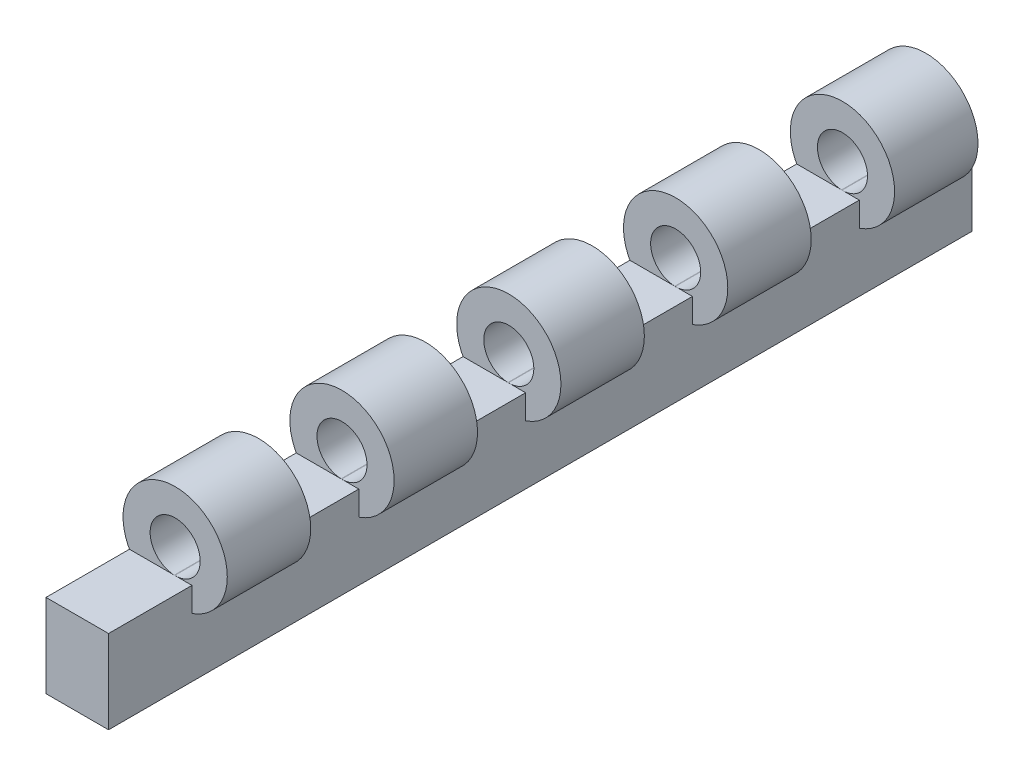
ISO-10303-21;
HEADER;
FILE_DESCRIPTION(('STEP AP214'),'2;1');
FILE_NAME('part.step','',(''),(''),'','','');
FILE_SCHEMA(('AUTOMOTIVE_DESIGN { 1 0 10303 214 1 1 1 1 }'));
ENDSEC;
DATA;
#1=APPLICATION_CONTEXT('core data for automotive mechanical design processes');
#2=APPLICATION_PROTOCOL_DEFINITION('international standard','automotive_design',2000,#1);
#3=PRODUCT_CONTEXT('',#1,'mechanical');
#4=PRODUCT('Part','Part','',(#3));
#5=PRODUCT_RELATED_PRODUCT_CATEGORY('part','',(#4));
#6=PRODUCT_DEFINITION_FORMATION('','',#4);
#7=PRODUCT_DEFINITION_CONTEXT('part definition',#1,'design');
#8=PRODUCT_DEFINITION('design','',#6,#7);
#9=PRODUCT_DEFINITION_SHAPE('','',#8);
#10=(LENGTH_UNIT() NAMED_UNIT(*) SI_UNIT(.MILLI.,.METRE.));
#11=(NAMED_UNIT(*) PLANE_ANGLE_UNIT() SI_UNIT($,.RADIAN.));
#12=(NAMED_UNIT(*) SI_UNIT($,.STERADIAN.) SOLID_ANGLE_UNIT());
#13=UNCERTAINTY_MEASURE_WITH_UNIT(LENGTH_MEASURE(1.E-05),#10,'distance_accuracy_value','');
#14=(GEOMETRIC_REPRESENTATION_CONTEXT(3) GLOBAL_UNCERTAINTY_ASSIGNED_CONTEXT((#13)) GLOBAL_UNIT_ASSIGNED_CONTEXT((#10,
#11,#12)) REPRESENTATION_CONTEXT('',''));
#15=CARTESIAN_POINT('',(0.,0.,0.));
#16=DIRECTION('',(0.,0.,1.));
#17=DIRECTION('',(1.,0.,0.));
#18=AXIS2_PLACEMENT_3D('',#15,#16,#17);
#19=CARTESIAN_POINT('',(10.9690054932678,25.9942404430136,-96.5));
#20=DIRECTION('',(0.,0.,1.));
#21=DIRECTION('',(1.,0.,0.));
#22=AXIS2_PLACEMENT_3D('',#19,#20,#21);
#23=CYLINDRICAL_SURFACE('',#22,12.5);
#24=CARTESIAN_POINT('',(10.9690054932678,25.9942404430136,-96.5));
#25=DIRECTION('',(0.,0.,1.));
#26=DIRECTION('',(1.,0.,0.));
#27=AXIS2_PLACEMENT_3D('',#24,#25,#26);
#28=CIRCLE('',#27,12.5);
#29=CARTESIAN_POINT('',(23.4690054932679,25.9942404430136,-96.5));
#30=VERTEX_POINT('',#29);
#31=EDGE_CURVE('E11',#30,#30,#28,.T.);
#32=ORIENTED_EDGE('',*,*,#31,.T.);
#33=EDGE_LOOP('',(#32));
#34=FACE_BOUND('',#33,.T.);
#35=CARTESIAN_POINT('',(10.9690054932678,25.9942404430136,-76.5));
#36=DIRECTION('',(0.,0.,1.));
#37=DIRECTION('',(1.,0.,0.));
#38=AXIS2_PLACEMENT_3D('',#35,#36,#37);
#39=CIRCLE('',#38,12.5);
#40=CARTESIAN_POINT('',(23.4690054932679,25.9942404430136,-76.5));
#41=VERTEX_POINT('',#40);
#42=EDGE_CURVE('E44',#41,#41,#39,.T.);
#43=ORIENTED_EDGE('',*,*,#42,.F.);
#44=EDGE_LOOP('',(#43));
#45=FACE_BOUND('',#44,.T.);
#46=ADVANCED_FACE('F41',(#34,#45),#23,.T.);
#47=CARTESIAN_POINT('',(10.9690054932678,25.9942404430136,-96.5));
#48=DIRECTION('',(0.,0.,1.));
#49=DIRECTION('',(1.,0.,0.));
#50=AXIS2_PLACEMENT_3D('',#47,#48,#49);
#51=PLANE('',#50);
#52=CARTESIAN_POINT('',(10.9690054932678,25.9942404430136,-96.5));
#53=DIRECTION('',(0.,0.,1.));
#54=DIRECTION('',(1.,0.,0.));
#55=AXIS2_PLACEMENT_3D('',#52,#53,#54);
#56=CIRCLE('',#55,6.);
#57=CARTESIAN_POINT('',(16.9690054932678,25.9942404430136,-96.5));
#58=VERTEX_POINT('',#57);
#59=EDGE_CURVE('E51',#58,#58,#56,.T.);
#60=ORIENTED_EDGE('',*,*,#59,.T.);
#61=EDGE_LOOP('',(#60));
#62=FACE_BOUND('',#61,.T.);
#63=ORIENTED_EDGE('',*,*,#31,.F.);
#64=EDGE_LOOP('',(#63));
#65=FACE_BOUND('',#64,.T.);
#66=ADVANCED_FACE('F59',(#62,#65),#51,.F.);
#67=CARTESIAN_POINT('',(10.9690054932678,25.9942404430136,-76.5));
#68=DIRECTION('',(0.,0.,1.));
#69=DIRECTION('',(1.,0.,0.));
#70=AXIS2_PLACEMENT_3D('',#67,#68,#69);
#71=PLANE('',#70);
#72=CARTESIAN_POINT('',(10.9690054932678,25.9942404430136,-76.5));
#73=DIRECTION('',(0.,0.,1.));
#74=DIRECTION('',(1.,0.,0.));
#75=AXIS2_PLACEMENT_3D('',#72,#73,#74);
#76=CIRCLE('',#75,6.);
#77=CARTESIAN_POINT('',(16.9690054932678,25.9942404430136,-76.5));
#78=VERTEX_POINT('',#77);
#79=EDGE_CURVE('E53',#78,#78,#76,.T.);
#80=ORIENTED_EDGE('',*,*,#79,.F.);
#81=EDGE_LOOP('',(#80));
#82=FACE_BOUND('',#81,.T.);
#83=ORIENTED_EDGE('',*,*,#42,.T.);
#84=EDGE_LOOP('',(#83));
#85=FACE_BOUND('',#84,.T.);
#86=ADVANCED_FACE('F65',(#82,#85),#71,.T.);
#87=CARTESIAN_POINT('',(10.9690054932678,25.9942404430136,-96.5));
#88=DIRECTION('',(0.,0.,1.));
#89=DIRECTION('',(1.,0.,0.));
#90=AXIS2_PLACEMENT_3D('',#87,#88,#89);
#91=CYLINDRICAL_SURFACE('',#90,6.);
#92=ORIENTED_EDGE('',*,*,#59,.F.);
#93=EDGE_LOOP('',(#92));
#94=FACE_BOUND('',#93,.T.);
#95=ORIENTED_EDGE('',*,*,#79,.T.);
#96=EDGE_LOOP('',(#95));
#97=FACE_BOUND('',#96,.T.);
#98=ADVANCED_FACE('F62',(#94,#97),#91,.F.);
#99=CLOSED_SHELL('',(#46,#66,#86,#98));
#100=MANIFOLD_SOLID_BREP('B2',#99);
#101=CARTESIAN_POINT('',(10.9690054932678,25.9942404430136,-56.5));
#102=DIRECTION('',(0.,0.,1.));
#103=DIRECTION('',(1.,0.,0.));
#104=AXIS2_PLACEMENT_3D('',#101,#102,#103);
#105=CYLINDRICAL_SURFACE('',#104,12.5);
#106=CARTESIAN_POINT('',(10.9690054932678,25.9942404430136,-56.5));
#107=DIRECTION('',(0.,0.,1.));
#108=DIRECTION('',(1.,0.,0.));
#109=AXIS2_PLACEMENT_3D('',#106,#107,#108);
#110=CIRCLE('',#109,12.5);
#111=CARTESIAN_POINT('',(23.4690054932679,25.9942404430136,-56.5));
#112=VERTEX_POINT('',#111);
#113=EDGE_CURVE('E40',#112,#112,#110,.T.);
#114=ORIENTED_EDGE('',*,*,#113,.T.);
#115=EDGE_LOOP('',(#114));
#116=FACE_BOUND('',#115,.T.);
#117=CARTESIAN_POINT('',(10.9690054932678,25.9942404430136,-36.5));
#118=DIRECTION('',(0.,0.,1.));
#119=DIRECTION('',(1.,0.,0.));
#120=AXIS2_PLACEMENT_3D('',#117,#118,#119);
#121=CIRCLE('',#120,12.5);
#122=CARTESIAN_POINT('',(23.4690054932679,25.9942404430136,-36.5));
#123=VERTEX_POINT('',#122);
#124=EDGE_CURVE('E113',#123,#123,#121,.T.);
#125=ORIENTED_EDGE('',*,*,#124,.F.);
#126=EDGE_LOOP('',(#125));
#127=FACE_BOUND('',#126,.T.);
#128=ADVANCED_FACE('F110',(#116,#127),#105,.T.);
#129=CARTESIAN_POINT('',(10.9690054932678,25.9942404430136,-56.5));
#130=DIRECTION('',(0.,0.,1.));
#131=DIRECTION('',(1.,0.,0.));
#132=AXIS2_PLACEMENT_3D('',#129,#130,#131);
#133=PLANE('',#132);
#134=CARTESIAN_POINT('',(10.9690054932678,25.9942404430136,-56.5));
#135=DIRECTION('',(0.,0.,1.));
#136=DIRECTION('',(1.,0.,0.));
#137=AXIS2_PLACEMENT_3D('',#134,#135,#136);
#138=CIRCLE('',#137,6.);
#139=CARTESIAN_POINT('',(16.9690054932678,25.9942404430136,-56.5));
#140=VERTEX_POINT('',#139);
#141=EDGE_CURVE('E120',#140,#140,#138,.T.);
#142=ORIENTED_EDGE('',*,*,#141,.T.);
#143=EDGE_LOOP('',(#142));
#144=FACE_BOUND('',#143,.T.);
#145=ORIENTED_EDGE('',*,*,#113,.F.);
#146=EDGE_LOOP('',(#145));
#147=FACE_BOUND('',#146,.T.);
#148=ADVANCED_FACE('F128',(#144,#147),#133,.F.);
#149=CARTESIAN_POINT('',(10.9690054932678,25.9942404430136,-36.5));
#150=DIRECTION('',(0.,0.,1.));
#151=DIRECTION('',(1.,0.,0.));
#152=AXIS2_PLACEMENT_3D('',#149,#150,#151);
#153=PLANE('',#152);
#154=CARTESIAN_POINT('',(10.9690054932678,25.9942404430136,-36.5));
#155=DIRECTION('',(0.,0.,1.));
#156=DIRECTION('',(1.,0.,0.));
#157=AXIS2_PLACEMENT_3D('',#154,#155,#156);
#158=CIRCLE('',#157,6.);
#159=CARTESIAN_POINT('',(16.9690054932678,25.9942404430136,-36.5));
#160=VERTEX_POINT('',#159);
#161=EDGE_CURVE('E122',#160,#160,#158,.T.);
#162=ORIENTED_EDGE('',*,*,#161,.F.);
#163=EDGE_LOOP('',(#162));
#164=FACE_BOUND('',#163,.T.);
#165=ORIENTED_EDGE('',*,*,#124,.T.);
#166=EDGE_LOOP('',(#165));
#167=FACE_BOUND('',#166,.T.);
#168=ADVANCED_FACE('F134',(#164,#167),#153,.T.);
#169=CARTESIAN_POINT('',(10.9690054932678,25.9942404430136,-56.5));
#170=DIRECTION('',(0.,0.,1.));
#171=DIRECTION('',(1.,0.,0.));
#172=AXIS2_PLACEMENT_3D('',#169,#170,#171);
#173=CYLINDRICAL_SURFACE('',#172,6.);
#174=ORIENTED_EDGE('',*,*,#141,.F.);
#175=EDGE_LOOP('',(#174));
#176=FACE_BOUND('',#175,.T.);
#177=ORIENTED_EDGE('',*,*,#161,.T.);
#178=EDGE_LOOP('',(#177));
#179=FACE_BOUND('',#178,.T.);
#180=ADVANCED_FACE('F131',(#176,#179),#173,.F.);
#181=CLOSED_SHELL('',(#128,#148,#168,#180));
#182=MANIFOLD_SOLID_BREP('B6',#181);
#183=CARTESIAN_POINT('',(10.9690054932678,25.9942404430136,-16.5));
#184=DIRECTION('',(0.,0.,1.));
#185=DIRECTION('',(1.,0.,0.));
#186=AXIS2_PLACEMENT_3D('',#183,#184,#185);
#187=CYLINDRICAL_SURFACE('',#186,12.5);
#188=CARTESIAN_POINT('',(10.9690054932678,25.9942404430136,-16.5));
#189=DIRECTION('',(0.,0.,1.));
#190=DIRECTION('',(1.,0.,0.));
#191=AXIS2_PLACEMENT_3D('',#188,#189,#190);
#192=CIRCLE('',#191,12.5);
#193=CARTESIAN_POINT('',(23.4690054932679,25.9942404430136,-16.5));
#194=VERTEX_POINT('',#193);
#195=EDGE_CURVE('E109',#194,#194,#192,.T.);
#196=ORIENTED_EDGE('',*,*,#195,.T.);
#197=EDGE_LOOP('',(#196));
#198=FACE_BOUND('',#197,.T.);
#199=CARTESIAN_POINT('',(10.9690054932678,25.9942404430136,3.49999999999999));
#200=DIRECTION('',(0.,0.,1.));
#201=DIRECTION('',(1.,0.,0.));
#202=AXIS2_PLACEMENT_3D('',#199,#200,#201);
#203=CIRCLE('',#202,12.5);
#204=CARTESIAN_POINT('',(23.4690054932679,25.9942404430136,3.49999999999999));
#205=VERTEX_POINT('',#204);
#206=EDGE_CURVE('E182',#205,#205,#203,.T.);
#207=ORIENTED_EDGE('',*,*,#206,.F.);
#208=EDGE_LOOP('',(#207));
#209=FACE_BOUND('',#208,.T.);
#210=ADVANCED_FACE('F179',(#198,#209),#187,.T.);
#211=CARTESIAN_POINT('',(10.9690054932678,25.9942404430136,-16.5));
#212=DIRECTION('',(0.,0.,1.));
#213=DIRECTION('',(1.,0.,0.));
#214=AXIS2_PLACEMENT_3D('',#211,#212,#213);
#215=PLANE('',#214);
#216=CARTESIAN_POINT('',(10.9690054932678,25.9942404430136,-16.5));
#217=DIRECTION('',(0.,0.,1.));
#218=DIRECTION('',(1.,0.,0.));
#219=AXIS2_PLACEMENT_3D('',#216,#217,#218);
#220=CIRCLE('',#219,6.);
#221=CARTESIAN_POINT('',(16.9690054932678,25.9942404430136,-16.5));
#222=VERTEX_POINT('',#221);
#223=EDGE_CURVE('E189',#222,#222,#220,.T.);
#224=ORIENTED_EDGE('',*,*,#223,.T.);
#225=EDGE_LOOP('',(#224));
#226=FACE_BOUND('',#225,.T.);
#227=ORIENTED_EDGE('',*,*,#195,.F.);
#228=EDGE_LOOP('',(#227));
#229=FACE_BOUND('',#228,.T.);
#230=ADVANCED_FACE('F197',(#226,#229),#215,.F.);
#231=CARTESIAN_POINT('',(10.9690054932678,25.9942404430136,3.49999999999999));
#232=DIRECTION('',(0.,0.,1.));
#233=DIRECTION('',(1.,0.,0.));
#234=AXIS2_PLACEMENT_3D('',#231,#232,#233);
#235=PLANE('',#234);
#236=CARTESIAN_POINT('',(10.9690054932678,25.9942404430136,3.49999999999999));
#237=DIRECTION('',(0.,0.,1.));
#238=DIRECTION('',(1.,0.,0.));
#239=AXIS2_PLACEMENT_3D('',#236,#237,#238);
#240=CIRCLE('',#239,6.);
#241=CARTESIAN_POINT('',(16.9690054932678,25.9942404430136,3.49999999999999));
#242=VERTEX_POINT('',#241);
#243=EDGE_CURVE('E191',#242,#242,#240,.T.);
#244=ORIENTED_EDGE('',*,*,#243,.F.);
#245=EDGE_LOOP('',(#244));
#246=FACE_BOUND('',#245,.T.);
#247=ORIENTED_EDGE('',*,*,#206,.T.);
#248=EDGE_LOOP('',(#247));
#249=FACE_BOUND('',#248,.T.);
#250=ADVANCED_FACE('F203',(#246,#249),#235,.T.);
#251=CARTESIAN_POINT('',(10.9690054932678,25.9942404430136,-16.5));
#252=DIRECTION('',(0.,0.,1.));
#253=DIRECTION('',(1.,0.,0.));
#254=AXIS2_PLACEMENT_3D('',#251,#252,#253);
#255=CYLINDRICAL_SURFACE('',#254,6.);
#256=ORIENTED_EDGE('',*,*,#223,.F.);
#257=EDGE_LOOP('',(#256));
#258=FACE_BOUND('',#257,.T.);
#259=ORIENTED_EDGE('',*,*,#243,.T.);
#260=EDGE_LOOP('',(#259));
#261=FACE_BOUND('',#260,.T.);
#262=ADVANCED_FACE('F200',(#258,#261),#255,.F.);
#263=CLOSED_SHELL('',(#210,#230,#250,#262));
#264=MANIFOLD_SOLID_BREP('B35',#263);
#265=CARTESIAN_POINT('',(10.9690054932678,25.9942404430136,23.5));
#266=DIRECTION('',(0.,0.,1.));
#267=DIRECTION('',(1.,0.,0.));
#268=AXIS2_PLACEMENT_3D('',#265,#266,#267);
#269=CYLINDRICAL_SURFACE('',#268,12.5);
#270=CARTESIAN_POINT('',(10.9690054932678,25.9942404430136,23.5));
#271=DIRECTION('',(0.,0.,1.));
#272=DIRECTION('',(1.,0.,0.));
#273=AXIS2_PLACEMENT_3D('',#270,#271,#272);
#274=CIRCLE('',#273,12.5);
#275=CARTESIAN_POINT('',(23.4690054932679,25.9942404430136,23.5));
#276=VERTEX_POINT('',#275);
#277=EDGE_CURVE('E178',#276,#276,#274,.T.);
#278=ORIENTED_EDGE('',*,*,#277,.T.);
#279=EDGE_LOOP('',(#278));
#280=FACE_BOUND('',#279,.T.);
#281=CARTESIAN_POINT('',(10.9690054932678,25.9942404430136,43.5));
#282=DIRECTION('',(0.,0.,1.));
#283=DIRECTION('',(1.,0.,0.));
#284=AXIS2_PLACEMENT_3D('',#281,#282,#283);
#285=CIRCLE('',#284,12.5);
#286=CARTESIAN_POINT('',(23.4690054932679,25.9942404430136,43.5));
#287=VERTEX_POINT('',#286);
#288=EDGE_CURVE('E251',#287,#287,#285,.T.);
#289=ORIENTED_EDGE('',*,*,#288,.F.);
#290=EDGE_LOOP('',(#289));
#291=FACE_BOUND('',#290,.T.);
#292=ADVANCED_FACE('F248',(#280,#291),#269,.T.);
#293=CARTESIAN_POINT('',(10.9690054932678,25.9942404430136,23.5));
#294=DIRECTION('',(0.,0.,1.));
#295=DIRECTION('',(1.,0.,0.));
#296=AXIS2_PLACEMENT_3D('',#293,#294,#295);
#297=PLANE('',#296);
#298=CARTESIAN_POINT('',(10.9690054932678,25.9942404430136,23.5));
#299=DIRECTION('',(0.,0.,1.));
#300=DIRECTION('',(1.,0.,0.));
#301=AXIS2_PLACEMENT_3D('',#298,#299,#300);
#302=CIRCLE('',#301,6.);
#303=CARTESIAN_POINT('',(16.9690054932678,25.9942404430136,23.5));
#304=VERTEX_POINT('',#303);
#305=EDGE_CURVE('E258',#304,#304,#302,.T.);
#306=ORIENTED_EDGE('',*,*,#305,.T.);
#307=EDGE_LOOP('',(#306));
#308=FACE_BOUND('',#307,.T.);
#309=ORIENTED_EDGE('',*,*,#277,.F.);
#310=EDGE_LOOP('',(#309));
#311=FACE_BOUND('',#310,.T.);
#312=ADVANCED_FACE('F266',(#308,#311),#297,.F.);
#313=CARTESIAN_POINT('',(10.9690054932678,25.9942404430136,43.5));
#314=DIRECTION('',(0.,0.,1.));
#315=DIRECTION('',(1.,0.,0.));
#316=AXIS2_PLACEMENT_3D('',#313,#314,#315);
#317=PLANE('',#316);
#318=CARTESIAN_POINT('',(10.9690054932678,25.9942404430136,43.5));
#319=DIRECTION('',(0.,0.,1.));
#320=DIRECTION('',(1.,0.,0.));
#321=AXIS2_PLACEMENT_3D('',#318,#319,#320);
#322=CIRCLE('',#321,6.);
#323=CARTESIAN_POINT('',(16.9690054932678,25.9942404430136,43.5));
#324=VERTEX_POINT('',#323);
#325=EDGE_CURVE('E260',#324,#324,#322,.T.);
#326=ORIENTED_EDGE('',*,*,#325,.F.);
#327=EDGE_LOOP('',(#326));
#328=FACE_BOUND('',#327,.T.);
#329=ORIENTED_EDGE('',*,*,#288,.T.);
#330=EDGE_LOOP('',(#329));
#331=FACE_BOUND('',#330,.T.);
#332=ADVANCED_FACE('F272',(#328,#331),#317,.T.);
#333=CARTESIAN_POINT('',(10.9690054932678,25.9942404430136,23.5));
#334=DIRECTION('',(0.,0.,1.));
#335=DIRECTION('',(1.,0.,0.));
#336=AXIS2_PLACEMENT_3D('',#333,#334,#335);
#337=CYLINDRICAL_SURFACE('',#336,6.);
#338=ORIENTED_EDGE('',*,*,#305,.F.);
#339=EDGE_LOOP('',(#338));
#340=FACE_BOUND('',#339,.T.);
#341=ORIENTED_EDGE('',*,*,#325,.T.);
#342=EDGE_LOOP('',(#341));
#343=FACE_BOUND('',#342,.T.);
#344=ADVANCED_FACE('F269',(#340,#343),#337,.F.);
#345=CLOSED_SHELL('',(#292,#312,#332,#344));
#346=MANIFOLD_SOLID_BREP('B104',#345);
#347=CARTESIAN_POINT('',(10.9690054932678,25.9942404430136,63.5));
#348=DIRECTION('',(0.,0.,1.));
#349=DIRECTION('',(1.,0.,0.));
#350=AXIS2_PLACEMENT_3D('',#347,#348,#349);
#351=CYLINDRICAL_SURFACE('',#350,12.5);
#352=CARTESIAN_POINT('',(10.9690054932678,25.9942404430136,63.5));
#353=DIRECTION('',(0.,0.,1.));
#354=DIRECTION('',(1.,0.,0.));
#355=AXIS2_PLACEMENT_3D('',#352,#353,#354);
#356=CIRCLE('',#355,12.5);
#357=CARTESIAN_POINT('',(23.4690054932679,25.9942404430136,63.5));
#358=VERTEX_POINT('',#357);
#359=EDGE_CURVE('E247',#358,#358,#356,.T.);
#360=ORIENTED_EDGE('',*,*,#359,.T.);
#361=EDGE_LOOP('',(#360));
#362=FACE_BOUND('',#361,.T.);
#363=CARTESIAN_POINT('',(10.9690054932678,25.9942404430136,83.5));
#364=DIRECTION('',(0.,0.,1.));
#365=DIRECTION('',(1.,0.,0.));
#366=AXIS2_PLACEMENT_3D('',#363,#364,#365);
#367=CIRCLE('',#366,12.5);
#368=CARTESIAN_POINT('',(23.4690054932679,25.9942404430136,83.5));
#369=VERTEX_POINT('',#368);
#370=EDGE_CURVE('E321',#369,#369,#367,.T.);
#371=ORIENTED_EDGE('',*,*,#370,.F.);
#372=EDGE_LOOP('',(#371));
#373=FACE_BOUND('',#372,.T.);
#374=ADVANCED_FACE('F318',(#362,#373),#351,.T.);
#375=CARTESIAN_POINT('',(10.9690054932678,25.9942404430136,63.5));
#376=DIRECTION('',(0.,0.,1.));
#377=DIRECTION('',(1.,0.,0.));
#378=AXIS2_PLACEMENT_3D('',#375,#376,#377);
#379=PLANE('',#378);
#380=CARTESIAN_POINT('',(10.9690054932678,25.9942404430136,63.5));
#381=DIRECTION('',(0.,0.,1.));
#382=DIRECTION('',(1.,0.,0.));
#383=AXIS2_PLACEMENT_3D('',#380,#381,#382);
#384=CIRCLE('',#383,6.);
#385=CARTESIAN_POINT('',(16.9690054932678,25.9942404430136,63.5));
#386=VERTEX_POINT('',#385);
#387=EDGE_CURVE('E328',#386,#386,#384,.T.);
#388=ORIENTED_EDGE('',*,*,#387,.T.);
#389=EDGE_LOOP('',(#388));
#390=FACE_BOUND('',#389,.T.);
#391=ORIENTED_EDGE('',*,*,#359,.F.);
#392=EDGE_LOOP('',(#391));
#393=FACE_BOUND('',#392,.T.);
#394=ADVANCED_FACE('F336',(#390,#393),#379,.F.);
#395=CARTESIAN_POINT('',(10.9690054932678,25.9942404430136,83.5));
#396=DIRECTION('',(0.,0.,1.));
#397=DIRECTION('',(1.,0.,0.));
#398=AXIS2_PLACEMENT_3D('',#395,#396,#397);
#399=PLANE('',#398);
#400=CARTESIAN_POINT('',(10.9690054932678,25.9942404430136,83.5));
#401=DIRECTION('',(0.,0.,1.));
#402=DIRECTION('',(1.,0.,0.));
#403=AXIS2_PLACEMENT_3D('',#400,#401,#402);
#404=CIRCLE('',#403,6.);
#405=CARTESIAN_POINT('',(16.9690054932678,25.9942404430136,83.5));
#406=VERTEX_POINT('',#405);
#407=EDGE_CURVE('E330',#406,#406,#404,.T.);
#408=ORIENTED_EDGE('',*,*,#407,.F.);
#409=EDGE_LOOP('',(#408));
#410=FACE_BOUND('',#409,.T.);
#411=ORIENTED_EDGE('',*,*,#370,.T.);
#412=EDGE_LOOP('',(#411));
#413=FACE_BOUND('',#412,.T.);
#414=ADVANCED_FACE('F342',(#410,#413),#399,.T.);
#415=CARTESIAN_POINT('',(10.9690054932678,25.9942404430136,63.5));
#416=DIRECTION('',(0.,0.,1.));
#417=DIRECTION('',(1.,0.,0.));
#418=AXIS2_PLACEMENT_3D('',#415,#416,#417);
#419=CYLINDRICAL_SURFACE('',#418,6.);
#420=ORIENTED_EDGE('',*,*,#387,.F.);
#421=EDGE_LOOP('',(#420));
#422=FACE_BOUND('',#421,.T.);
#423=ORIENTED_EDGE('',*,*,#407,.T.);
#424=EDGE_LOOP('',(#423));
#425=FACE_BOUND('',#424,.T.);
#426=ADVANCED_FACE('F339',(#422,#425),#419,.F.);
#427=CLOSED_SHELL('',(#374,#394,#414,#426));
#428=MANIFOLD_SOLID_BREP('B173',#427);
#429=CARTESIAN_POINT('',(15.,20.,103.5));
#430=DIRECTION('',(0.,0.,-1.));
#431=DIRECTION('',(-1.,0.,0.));
#432=AXIS2_PLACEMENT_3D('',#429,#430,#431);
#433=PLANE('',#432);
#434=DIRECTION('',(1.,0.,0.));
#435=VECTOR('',#434,1.);
#436=CARTESIAN_POINT('',(15.,0.,103.5));
#437=LINE('',#436,#435);
#438=CARTESIAN_POINT('',(0.,0.,103.5));
#439=VERTEX_POINT('',#438);
#440=CARTESIAN_POINT('',(15.,0.,103.5));
#441=VERTEX_POINT('',#440);
#442=EDGE_CURVE('E442',#439,#441,#437,.T.);
#443=ORIENTED_EDGE('',*,*,#442,.T.);
#444=DIRECTION('',(0.,-1.,0.));
#445=VECTOR('',#444,1.);
#446=CARTESIAN_POINT('',(15.,20.,103.5));
#447=LINE('',#446,#445);
#448=CARTESIAN_POINT('',(15.,20.,103.5));
#449=VERTEX_POINT('',#448);
#450=EDGE_CURVE('E316',#449,#441,#447,.T.);
#451=ORIENTED_EDGE('',*,*,#450,.F.);
#452=DIRECTION('',(1.,0.,0.));
#453=VECTOR('',#452,1.);
#454=CARTESIAN_POINT('',(15.,20.,103.5));
#455=LINE('',#454,#453);
#456=CARTESIAN_POINT('',(0.,20.,103.5));
#457=VERTEX_POINT('',#456);
#458=EDGE_CURVE('E430',#457,#449,#455,.T.);
#459=ORIENTED_EDGE('',*,*,#458,.F.);
#460=DIRECTION('',(0.,-1.,0.));
#461=VECTOR('',#460,1.);
#462=CARTESIAN_POINT('',(0.,20.,103.5));
#463=LINE('',#462,#461);
#464=EDGE_CURVE('E438',#457,#439,#463,.T.);
#465=ORIENTED_EDGE('',*,*,#464,.T.);
#466=EDGE_LOOP('',(#443,#451,#459,#465));
#467=FACE_BOUND('',#466,.T.);
#468=ADVANCED_FACE('F379',(#467),#433,.F.);
#469=CARTESIAN_POINT('',(15.,20.,-103.5));
#470=DIRECTION('',(-1.,0.,0.));
#471=DIRECTION('',(0.,0.,1.));
#472=AXIS2_PLACEMENT_3D('',#469,#470,#471);
#473=PLANE('',#472);
#474=DIRECTION('',(0.,0.,-1.));
#475=VECTOR('',#474,1.);
#476=CARTESIAN_POINT('',(15.,0.,-103.5));
#477=LINE('',#476,#475);
#478=CARTESIAN_POINT('',(15.,0.,-103.5));
#479=VERTEX_POINT('',#478);
#480=EDGE_CURVE('E434',#441,#479,#477,.T.);
#481=ORIENTED_EDGE('',*,*,#480,.T.);
#482=DIRECTION('',(0.,-1.,0.));
#483=VECTOR('',#482,1.);
#484=CARTESIAN_POINT('',(15.,20.,-103.5));
#485=LINE('',#484,#483);
#486=CARTESIAN_POINT('',(15.,20.,-103.5));
#487=VERTEX_POINT('',#486);
#488=EDGE_CURVE('E387',#487,#479,#485,.T.);
#489=ORIENTED_EDGE('',*,*,#488,.F.);
#490=DIRECTION('',(0.,0.,-1.));
#491=VECTOR('',#490,1.);
#492=CARTESIAN_POINT('',(15.,20.,-103.5));
#493=LINE('',#492,#491);
#494=EDGE_CURVE('E425',#449,#487,#493,.T.);
#495=ORIENTED_EDGE('',*,*,#494,.F.);
#496=ORIENTED_EDGE('',*,*,#450,.T.);
#497=EDGE_LOOP('',(#481,#489,#495,#496));
#498=FACE_BOUND('',#497,.T.);
#499=ADVANCED_FACE('F433',(#498),#473,.F.);
#500=CARTESIAN_POINT('',(0.,20.,-103.5));
#501=DIRECTION('',(0.,0.,1.));
#502=DIRECTION('',(1.,0.,0.));
#503=AXIS2_PLACEMENT_3D('',#500,#501,#502);
#504=PLANE('',#503);
#505=DIRECTION('',(-1.,0.,0.));
#506=VECTOR('',#505,1.);
#507=CARTESIAN_POINT('',(0.,0.,-103.5));
#508=LINE('',#507,#506);
#509=CARTESIAN_POINT('',(0.,0.,-103.5));
#510=VERTEX_POINT('',#509);
#511=EDGE_CURVE('E412',#479,#510,#508,.T.);
#512=ORIENTED_EDGE('',*,*,#511,.T.);
#513=DIRECTION('',(0.,-1.,0.));
#514=VECTOR('',#513,1.);
#515=CARTESIAN_POINT('',(0.,20.,-103.5));
#516=LINE('',#515,#514);
#517=CARTESIAN_POINT('',(0.,20.,-103.5));
#518=VERTEX_POINT('',#517);
#519=EDGE_CURVE('E435',#518,#510,#516,.T.);
#520=ORIENTED_EDGE('',*,*,#519,.F.);
#521=DIRECTION('',(-1.,0.,0.));
#522=VECTOR('',#521,1.);
#523=CARTESIAN_POINT('',(0.,20.,-103.5));
#524=LINE('',#523,#522);
#525=EDGE_CURVE('E428',#487,#518,#524,.T.);
#526=ORIENTED_EDGE('',*,*,#525,.F.);
#527=ORIENTED_EDGE('',*,*,#488,.T.);
#528=EDGE_LOOP('',(#512,#520,#526,#527));
#529=FACE_BOUND('',#528,.T.);
#530=ADVANCED_FACE('F436',(#529),#504,.F.);
#531=CARTESIAN_POINT('',(0.,20.,-103.5));
#532=DIRECTION('',(1.,0.,0.));
#533=DIRECTION('',(0.,0.,-1.));
#534=AXIS2_PLACEMENT_3D('',#531,#532,#533);
#535=PLANE('',#534);
#536=DIRECTION('',(0.,0.,1.));
#537=VECTOR('',#536,1.);
#538=CARTESIAN_POINT('',(0.,0.,-103.5));
#539=LINE('',#538,#537);
#540=EDGE_CURVE('E418',#510,#439,#539,.T.);
#541=ORIENTED_EDGE('',*,*,#540,.T.);
#542=ORIENTED_EDGE('',*,*,#464,.F.);
#543=DIRECTION('',(0.,0.,1.));
#544=VECTOR('',#543,1.);
#545=CARTESIAN_POINT('',(0.,20.,-103.5));
#546=LINE('',#545,#544);
#547=EDGE_CURVE('E395',#518,#457,#546,.T.);
#548=ORIENTED_EDGE('',*,*,#547,.F.);
#549=ORIENTED_EDGE('',*,*,#519,.T.);
#550=EDGE_LOOP('',(#541,#542,#548,#549));
#551=FACE_BOUND('',#550,.T.);
#552=ADVANCED_FACE('F449',(#551),#535,.F.);
#553=CARTESIAN_POINT('',(0.,20.,0.));
#554=DIRECTION('',(0.,1.,0.));
#555=DIRECTION('',(0.,0.,1.));
#556=AXIS2_PLACEMENT_3D('',#553,#554,#555);
#557=PLANE('',#556);
#558=ORIENTED_EDGE('',*,*,#458,.T.);
#559=ORIENTED_EDGE('',*,*,#494,.T.);
#560=ORIENTED_EDGE('',*,*,#525,.T.);
#561=ORIENTED_EDGE('',*,*,#547,.T.);
#562=EDGE_LOOP('',(#558,#559,#560,#561));
#563=FACE_BOUND('',#562,.T.);
#564=ADVANCED_FACE('F426',(#563),#557,.T.);
#565=CARTESIAN_POINT('',(0.,0.,0.));
#566=DIRECTION('',(0.,1.,0.));
#567=DIRECTION('',(0.,0.,1.));
#568=AXIS2_PLACEMENT_3D('',#565,#566,#567);
#569=PLANE('',#568);
#570=ORIENTED_EDGE('',*,*,#442,.F.);
#571=ORIENTED_EDGE('',*,*,#540,.F.);
#572=ORIENTED_EDGE('',*,*,#511,.F.);
#573=ORIENTED_EDGE('',*,*,#480,.F.);
#574=EDGE_LOOP('',(#570,#571,#572,#573));
#575=FACE_BOUND('',#574,.T.);
#576=ADVANCED_FACE('F452',(#575),#569,.F.);
#577=CLOSED_SHELL('',(#468,#499,#530,#552,#564,#576));
#578=MANIFOLD_SOLID_BREP('B242',#577);
#579=ADVANCED_BREP_SHAPE_REPRESENTATION('',(#18,#100,#182,#264,#346,#428,#578),#14);
#580=SHAPE_DEFINITION_REPRESENTATION(#9,#579);
ENDSEC;
END-ISO-10303-21;
